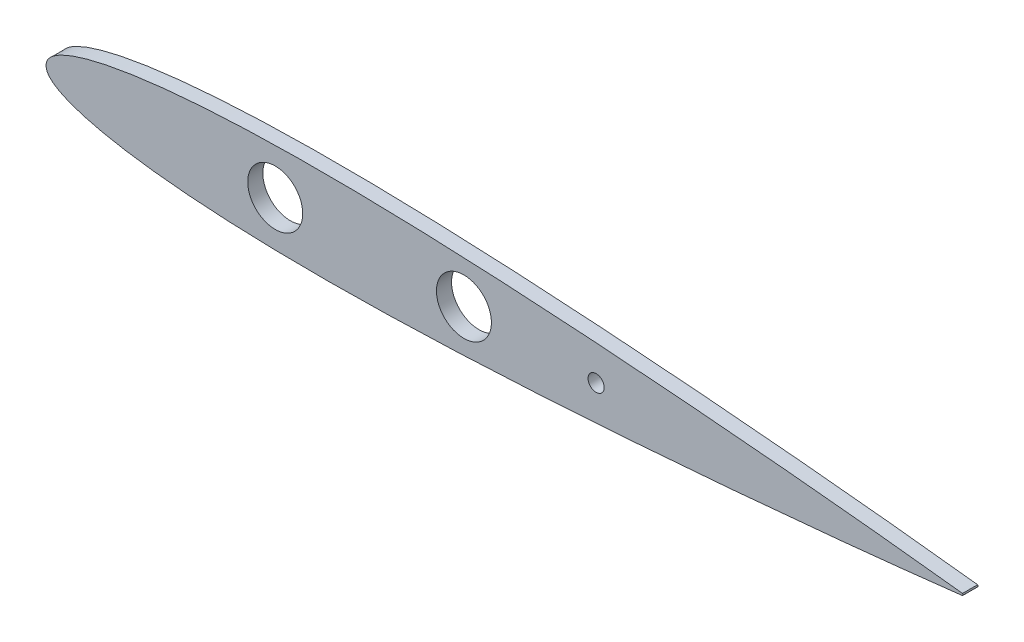
ISO-10303-21;
HEADER;
FILE_DESCRIPTION(('STEP AP214'),'2;1');
FILE_NAME('part.step','',(''),(''),'','','');
FILE_SCHEMA(('AUTOMOTIVE_DESIGN { 1 0 10303 214 1 1 1 1 }'));
ENDSEC;
DATA;
#1=APPLICATION_CONTEXT('core data for automotive mechanical design processes');
#2=APPLICATION_PROTOCOL_DEFINITION('international standard','automotive_design',2000,#1);
#3=PRODUCT_CONTEXT('',#1,'mechanical');
#4=PRODUCT('Part','Part','',(#3));
#5=PRODUCT_RELATED_PRODUCT_CATEGORY('part','',(#4));
#6=PRODUCT_DEFINITION_FORMATION('','',#4);
#7=PRODUCT_DEFINITION_CONTEXT('part definition',#1,'design');
#8=PRODUCT_DEFINITION('design','',#6,#7);
#9=PRODUCT_DEFINITION_SHAPE('','',#8);
#10=(LENGTH_UNIT() NAMED_UNIT(*) SI_UNIT(.MILLI.,.METRE.));
#11=(NAMED_UNIT(*) PLANE_ANGLE_UNIT() SI_UNIT($,.RADIAN.));
#12=(NAMED_UNIT(*) SI_UNIT($,.STERADIAN.) SOLID_ANGLE_UNIT());
#13=UNCERTAINTY_MEASURE_WITH_UNIT(LENGTH_MEASURE(1.E-05),#10,'distance_accuracy_value','');
#14=(GEOMETRIC_REPRESENTATION_CONTEXT(3) GLOBAL_UNCERTAINTY_ASSIGNED_CONTEXT((#13)) GLOBAL_UNIT_ASSIGNED_CONTEXT((#10,
#11,#12)) REPRESENTATION_CONTEXT('',''));
#15=CARTESIAN_POINT('',(0.,0.,0.));
#16=DIRECTION('',(0.,0.,1.));
#17=DIRECTION('',(1.,0.,0.));
#18=AXIS2_PLACEMENT_3D('',#15,#16,#17);
#19=CARTESIAN_POINT('',(110.,0.,1.4));
#20=CARTESIAN_POINT('',(110.027578175867,-0.236721440142772,1.4));
#21=CARTESIAN_POINT('',(110.085538217979,-0.734230220465975,1.4));
#22=CARTESIAN_POINT('',(110.530223641577,-1.42706975809109,1.4));
#23=CARTESIAN_POINT('',(111.196336340545,-2.07855523302878,1.4));
#24=CARTESIAN_POINT('',(112.109835923497,-2.70130638754161,1.4));
#25=CARTESIAN_POINT('',(113.256788366372,-3.29930923783809,1.4));
#26=CARTESIAN_POINT('',(114.637939719778,-3.87306046577258,1.4));
#27=CARTESIAN_POINT('',(116.24766579781,-4.42139238611828,1.4));
#28=CARTESIAN_POINT('',(118.081312132678,-4.94256764101073,1.4));
#29=CARTESIAN_POINT('',(120.133109351335,-5.43479747619412,1.4));
#30=CARTESIAN_POINT('',(122.397158973637,-5.89612056643677,1.4));
#31=CARTESIAN_POINT('',(124.867245825052,-6.32466607739586,1.4));
#32=CARTESIAN_POINT('',(127.536961088608,-6.71865034112428,1.4));
#33=CARTESIAN_POINT('',(130.399721685833,-7.07642431038863,1.4));
#34=CARTESIAN_POINT('',(133.44876289533,-7.39648056861162,1.4));
#35=CARTESIAN_POINT('',(136.677139412155,-7.67760454203032,1.4));
#36=CARTESIAN_POINT('',(140.077743555427,-7.91867894287145,1.4));
#37=CARTESIAN_POINT('',(143.643266298458,-8.11897556141504,1.4));
#38=CARTESIAN_POINT('',(147.366223919106,-8.27798597685019,1.4));
#39=CARTESIAN_POINT('',(151.238917925322,-8.39550607585732,1.4));
#40=CARTESIAN_POINT('',(155.253439755899,-8.47152880790102,1.4));
#41=CARTESIAN_POINT('',(159.401643403725,-8.50652296727325,1.4));
#42=CARTESIAN_POINT('',(163.675147454163,-8.5010026998616,1.4));
#43=CARTESIAN_POINT('',(168.065295924147,-8.45595366245417,1.4));
#44=CARTESIAN_POINT('',(172.563150271755,-8.37248656398386,1.4));
#45=CARTESIAN_POINT('',(177.159453511195,-8.25195768192942,1.4));
#46=CARTESIAN_POINT('',(181.844626933159,-8.09595849303594,1.4));
#47=CARTESIAN_POINT('',(186.60870012693,-7.90621829286941,1.4));
#48=CARTESIAN_POINT('',(191.441311474098,-7.68460443906704,1.4));
#49=CARTESIAN_POINT('',(196.331634567492,-7.43310533690328,1.4));
#50=CARTESIAN_POINT('',(201.268368916985,-7.15382688632495,1.4));
#51=CARTESIAN_POINT('',(206.239642946259,-6.84887299963153,1.4));
#52=CARTESIAN_POINT('',(211.232977593233,-6.52047434958792,1.4));
#53=CARTESIAN_POINT('',(216.235178286271,-6.17086457697306,1.4));
#54=CARTESIAN_POINT('',(221.232257466585,-5.802244474926,1.4));
#55=CARTESIAN_POINT('',(226.209311113548,-5.41695826474113,1.4));
#56=CARTESIAN_POINT('',(231.150377302515,-5.0173511026198,1.4));
#57=CARTESIAN_POINT('',(236.038226964104,-4.60581174883637,1.4));
#58=CARTESIAN_POINT('',(240.854179313273,-4.18491264898859,1.4));
#59=CARTESIAN_POINT('',(247.071089235748,-3.62220530992837,1.4));
#60=CARTESIAN_POINT('',(253.11611192075,-3.04786904369115,1.4));
#61=CARTESIAN_POINT('',(258.952644661846,-2.46718813772147,1.4));
#62=CARTESIAN_POINT('',(263.047743378214,-2.04785660385741,1.4));
#63=CARTESIAN_POINT('',(266.898988861825,-1.64260730411104,1.4));
#64=CARTESIAN_POINT('',(270.455833183168,-1.25859090467058,1.4));
#65=CARTESIAN_POINT('',(273.651166983567,-0.905304265461349,1.4));
#66=CARTESIAN_POINT('',(276.385426802208,-0.59643648193733,1.4));
#67=CARTESIAN_POINT('',(278.452596210234,-0.358958360844466,1.4));
#68=CARTESIAN_POINT('',(279.592043703671,-0.226075897783468,1.4));
#69=CARTESIAN_POINT('',(280.,-0.1785,1.4));
#70=B_SPLINE_CURVE_WITH_KNOTS('',3,(#19,#20,#21,#22,#23,#24,#25,#26,#27,#28,#29,#30,#31,#32,#33,
#34,#35,#36,#37,#38,#39,#40,#41,#42,#43,#44,#45,#46,#47,#48,#49,#50,#51,#52,#53,#54,#55,#56,#57,
#58,#59,#60,#61,#62,#63,#64,#65,#66,#67,#68,#69),.UNSPECIFIED.,.F.,.F.,(4,1,1,1,1,1,1,1,1,1,1,1,
1,1,1,1,1,1,1,1,1,1,1,1,1,1,1,1,1,1,1,1,1,1,1,1,1,1,1,1,1,1,1,1,1,1,1,1,4),(0.,
0.00409901119627066,0.00861474169622249,0.013934854724959,0.0202777746115639,0.0277529807018305,
0.0364102145151919,0.0462664329749759,0.057320237837208,0.0695589461393541,0.0829628608595683,
0.0975072182865541,0.113164081930894,0.129902689855954,0.147690303906216,0.166492184642367,
0.186271967143026,0.206991861424858,0.228612214931177,0.25109216492606,0.274388983443375,
0.298458209116087,0.323253842050884,0.348727970896163,0.374830386774719,0.401509190431855,
0.428710015672103,0.456376153594157,0.484448082863221,0.512863886613239,0.541558094079446,
0.570462312854758,0.599504247573885,0.628607348748546,0.657690446050344,0.68666723740018,
0.715444848929875,0.743923546361862,0.771994829811623,0.799540252867686,0.852512114582347,
0.877624445997917,0.901571133904992,0.924121062493777,0.944988816236938,0.963803938777258,
0.980044339265455,0.992855276358985,1.),.UNSPECIFIED.);
#71=DIRECTION('',(0.,0.,-1.));
#72=VECTOR('',#71,1.);
#73=SURFACE_OF_LINEAR_EXTRUSION('',#70,#72);
#74=CARTESIAN_POINT('',(110.,0.,-1.4));
#75=CARTESIAN_POINT('',(110.027578175867,-0.236721440142772,-1.4));
#76=CARTESIAN_POINT('',(110.085538217979,-0.734230220465975,-1.4));
#77=CARTESIAN_POINT('',(110.530223641577,-1.42706975809109,-1.4));
#78=CARTESIAN_POINT('',(111.196336340545,-2.07855523302878,-1.4));
#79=CARTESIAN_POINT('',(112.109835923497,-2.70130638754161,-1.4));
#80=CARTESIAN_POINT('',(113.256788366372,-3.29930923783809,-1.4));
#81=CARTESIAN_POINT('',(114.637939719778,-3.87306046577258,-1.4));
#82=CARTESIAN_POINT('',(116.24766579781,-4.42139238611828,-1.4));
#83=CARTESIAN_POINT('',(118.081312132678,-4.94256764101073,-1.4));
#84=CARTESIAN_POINT('',(120.133109351335,-5.43479747619412,-1.4));
#85=CARTESIAN_POINT('',(122.397158973637,-5.89612056643677,-1.4));
#86=CARTESIAN_POINT('',(124.867245825052,-6.32466607739586,-1.4));
#87=CARTESIAN_POINT('',(127.536961088608,-6.71865034112428,-1.4));
#88=CARTESIAN_POINT('',(130.399721685833,-7.07642431038863,-1.4));
#89=CARTESIAN_POINT('',(133.44876289533,-7.39648056861162,-1.4));
#90=CARTESIAN_POINT('',(136.677139412155,-7.67760454203032,-1.4));
#91=CARTESIAN_POINT('',(140.077743555427,-7.91867894287145,-1.4));
#92=CARTESIAN_POINT('',(143.643266298458,-8.11897556141504,-1.4));
#93=CARTESIAN_POINT('',(147.366223919106,-8.27798597685019,-1.4));
#94=CARTESIAN_POINT('',(151.238917925322,-8.39550607585732,-1.4));
#95=CARTESIAN_POINT('',(155.253439755899,-8.47152880790102,-1.4));
#96=CARTESIAN_POINT('',(159.401643403725,-8.50652296727325,-1.4));
#97=CARTESIAN_POINT('',(163.675147454163,-8.5010026998616,-1.4));
#98=CARTESIAN_POINT('',(168.065295924147,-8.45595366245417,-1.4));
#99=CARTESIAN_POINT('',(172.563150271755,-8.37248656398386,-1.4));
#100=CARTESIAN_POINT('',(177.159453511195,-8.25195768192942,-1.4));
#101=CARTESIAN_POINT('',(181.844626933159,-8.09595849303594,-1.4));
#102=CARTESIAN_POINT('',(186.60870012693,-7.90621829286941,-1.4));
#103=CARTESIAN_POINT('',(191.441311474098,-7.68460443906704,-1.4));
#104=CARTESIAN_POINT('',(196.331634567492,-7.43310533690328,-1.4));
#105=CARTESIAN_POINT('',(201.268368916985,-7.15382688632495,-1.4));
#106=CARTESIAN_POINT('',(206.239642946259,-6.84887299963153,-1.4));
#107=CARTESIAN_POINT('',(211.232977593233,-6.52047434958792,-1.4));
#108=CARTESIAN_POINT('',(216.235178286271,-6.17086457697306,-1.4));
#109=CARTESIAN_POINT('',(221.232257466585,-5.802244474926,-1.4));
#110=CARTESIAN_POINT('',(226.209311113548,-5.41695826474113,-1.4));
#111=CARTESIAN_POINT('',(231.150377302515,-5.0173511026198,-1.4));
#112=CARTESIAN_POINT('',(236.038226964104,-4.60581174883637,-1.4));
#113=CARTESIAN_POINT('',(240.854179313273,-4.18491264898859,-1.4));
#114=CARTESIAN_POINT('',(247.071089235748,-3.62220530992837,-1.4));
#115=CARTESIAN_POINT('',(253.11611192075,-3.04786904369115,-1.4));
#116=CARTESIAN_POINT('',(258.952644661846,-2.46718813772147,-1.4));
#117=CARTESIAN_POINT('',(263.047743378214,-2.04785660385741,-1.4));
#118=CARTESIAN_POINT('',(266.898988861825,-1.64260730411104,-1.4));
#119=CARTESIAN_POINT('',(270.455833183168,-1.25859090467058,-1.4));
#120=CARTESIAN_POINT('',(273.651166983567,-0.905304265461349,-1.4));
#121=CARTESIAN_POINT('',(276.385426802208,-0.59643648193733,-1.4));
#122=CARTESIAN_POINT('',(278.452596210234,-0.358958360844466,-1.4));
#123=CARTESIAN_POINT('',(279.592043703671,-0.226075897783468,-1.4));
#124=CARTESIAN_POINT('',(280.,-0.1785,-1.4));
#125=B_SPLINE_CURVE_WITH_KNOTS('',3,(#74,#75,#76,#77,#78,#79,#80,#81,#82,#83,#84,#85,#86,#87,
#88,#89,#90,#91,#92,#93,#94,#95,#96,#97,#98,#99,#100,#101,#102,#103,#104,#105,#106,#107,#108,
#109,#110,#111,#112,#113,#114,#115,#116,#117,#118,#119,#120,#121,#122,#123,#124),.UNSPECIFIED.,
.F.,.F.,(4,1,1,1,1,1,1,1,1,1,1,1,1,1,1,1,1,1,1,1,1,1,1,1,1,1,1,1,1,1,1,1,1,1,1,1,1,1,1,1,1,1,1,
1,1,1,1,1,4),(0.,0.00409901119627066,0.00861474169622249,0.013934854724959,0.0202777746115639,
0.0277529807018305,0.0364102145151919,0.0462664329749759,0.057320237837208,0.0695589461393541,
0.0829628608595683,0.0975072182865541,0.113164081930894,0.129902689855954,0.147690303906216,
0.166492184642367,0.186271967143026,0.206991861424858,0.228612214931177,0.25109216492606,
0.274388983443375,0.298458209116087,0.323253842050884,0.348727970896163,0.374830386774719,
0.401509190431855,0.428710015672103,0.456376153594157,0.484448082863221,0.512863886613239,
0.541558094079446,0.570462312854758,0.599504247573885,0.628607348748546,0.657690446050344,
0.68666723740018,0.715444848929875,0.743923546361862,0.771994829811623,0.799540252867686,
0.852512114582347,0.877624445997917,0.901571133904992,0.924121062493777,0.944988816236938,
0.963803938777258,0.980044339265455,0.992855276358985,1.),.UNSPECIFIED.);
#126=CARTESIAN_POINT('',(110.,0.,-1.4));
#127=VERTEX_POINT('',#126);
#128=CARTESIAN_POINT('',(280.,-0.1785,-1.4));
#129=VERTEX_POINT('',#128);
#130=EDGE_CURVE('E86',#127,#129,#125,.T.);
#131=ORIENTED_EDGE('',*,*,#130,.T.);
#132=DIRECTION('',(0.,0.,-1.));
#133=VECTOR('',#132,1.);
#134=CARTESIAN_POINT('',(280.,-0.1785,1.4));
#135=LINE('',#134,#133);
#136=CARTESIAN_POINT('',(280.,-0.1785,1.4));
#137=VERTEX_POINT('',#136);
#138=EDGE_CURVE('E11',#137,#129,#135,.T.);
#139=ORIENTED_EDGE('',*,*,#138,.F.);
#140=CARTESIAN_POINT('',(110.,0.,1.4));
#141=VERTEX_POINT('',#140);
#142=EDGE_CURVE('E75',#141,#137,#70,.T.);
#143=ORIENTED_EDGE('',*,*,#142,.F.);
#144=DIRECTION('',(0.,0.,-1.));
#145=VECTOR('',#144,1.);
#146=CARTESIAN_POINT('',(110.,0.,1.4));
#147=LINE('',#146,#145);
#148=EDGE_CURVE('E207',#141,#127,#147,.T.);
#149=ORIENTED_EDGE('',*,*,#148,.T.);
#150=EDGE_LOOP('',(#131,#139,#143,#149));
#151=FACE_BOUND('',#150,.T.);
#152=ADVANCED_FACE('F41',(#151),#73,.F.);
#153=CARTESIAN_POINT('',(279.8215,0.,1.4));
#154=DIRECTION('',(0.,0.,-1.));
#155=DIRECTION('',(-1.,0.,0.));
#156=AXIS2_PLACEMENT_3D('',#153,#154,#155);
#157=CYLINDRICAL_SURFACE('',#156,0.252437120883675);
#158=CARTESIAN_POINT('',(279.8215,0.,-1.4));
#159=DIRECTION('',(0.,0.,1.));
#160=DIRECTION('',(1.,0.,0.));
#161=AXIS2_PLACEMENT_3D('',#158,#159,#160);
#162=CIRCLE('',#161,0.252437120883675);
#163=CARTESIAN_POINT('',(280.,0.1785,-1.4));
#164=VERTEX_POINT('',#163);
#165=EDGE_CURVE('E228',#164,#129,#162,.F.);
#166=ORIENTED_EDGE('',*,*,#165,.F.);
#167=DIRECTION('',(0.,0.,-1.));
#168=VECTOR('',#167,1.);
#169=CARTESIAN_POINT('',(280.,0.1785,1.4));
#170=LINE('',#169,#168);
#171=CARTESIAN_POINT('',(280.,0.1785,1.4));
#172=VERTEX_POINT('',#171);
#173=EDGE_CURVE('E51',#172,#164,#170,.T.);
#174=ORIENTED_EDGE('',*,*,#173,.F.);
#175=CARTESIAN_POINT('',(279.8215,0.,1.4));
#176=DIRECTION('',(0.,0.,1.));
#177=DIRECTION('',(1.,0.,0.));
#178=AXIS2_PLACEMENT_3D('',#175,#176,#177);
#179=CIRCLE('',#178,0.252437120883675);
#180=EDGE_CURVE('E80',#172,#137,#179,.F.);
#181=ORIENTED_EDGE('',*,*,#180,.T.);
#182=ORIENTED_EDGE('',*,*,#138,.T.);
#183=EDGE_LOOP('',(#166,#174,#181,#182));
#184=FACE_BOUND('',#183,.T.);
#185=ADVANCED_FACE('F90',(#184),#157,.T.);
#186=CARTESIAN_POINT('',(187.518484280221,0.,1.4));
#187=DIRECTION('',(0.,0.,-1.));
#188=DIRECTION('',(-1.,0.,0.));
#189=AXIS2_PLACEMENT_3D('',#186,#187,#188);
#190=CYLINDRICAL_SURFACE('',#189,5.09999999999998);
#191=CARTESIAN_POINT('',(187.518484280221,0.,1.4));
#192=DIRECTION('',(0.,0.,1.));
#193=DIRECTION('',(1.,0.,0.));
#194=AXIS2_PLACEMENT_3D('',#191,#192,#193);
#195=CIRCLE('',#194,5.09999999999998);
#196=CARTESIAN_POINT('',(192.618484280221,0.,1.4));
#197=VERTEX_POINT('',#196);
#198=EDGE_CURVE('E214',#197,#197,#195,.T.);
#199=ORIENTED_EDGE('',*,*,#198,.T.);
#200=EDGE_LOOP('',(#199));
#201=FACE_BOUND('',#200,.T.);
#202=CARTESIAN_POINT('',(187.518484280221,0.,-1.4));
#203=DIRECTION('',(0.,0.,1.));
#204=DIRECTION('',(1.,0.,0.));
#205=AXIS2_PLACEMENT_3D('',#202,#203,#204);
#206=CIRCLE('',#205,5.09999999999998);
#207=CARTESIAN_POINT('',(192.618484280221,0.,-1.4));
#208=VERTEX_POINT('',#207);
#209=EDGE_CURVE('E197',#208,#208,#206,.T.);
#210=ORIENTED_EDGE('',*,*,#209,.F.);
#211=EDGE_LOOP('',(#210));
#212=FACE_BOUND('',#211,.T.);
#213=ADVANCED_FACE('F115',(#201,#212),#190,.F.);
#214=CARTESIAN_POINT('',(152.518484280221,0.,1.4));
#215=DIRECTION('',(0.,0.,-1.));
#216=DIRECTION('',(-1.,0.,0.));
#217=AXIS2_PLACEMENT_3D('',#214,#215,#216);
#218=CYLINDRICAL_SURFACE('',#217,5.09999999999998);
#219=CARTESIAN_POINT('',(152.518484280221,0.,1.4));
#220=DIRECTION('',(0.,0.,1.));
#221=DIRECTION('',(1.,0.,0.));
#222=AXIS2_PLACEMENT_3D('',#219,#220,#221);
#223=CIRCLE('',#222,5.09999999999998);
#224=CARTESIAN_POINT('',(157.618484280221,0.,1.4));
#225=VERTEX_POINT('',#224);
#226=EDGE_CURVE('E94',#225,#225,#223,.T.);
#227=ORIENTED_EDGE('',*,*,#226,.T.);
#228=EDGE_LOOP('',(#227));
#229=FACE_BOUND('',#228,.T.);
#230=CARTESIAN_POINT('',(152.518484280221,0.,-1.4));
#231=DIRECTION('',(0.,0.,1.));
#232=DIRECTION('',(1.,0.,0.));
#233=AXIS2_PLACEMENT_3D('',#230,#231,#232);
#234=CIRCLE('',#233,5.09999999999998);
#235=CARTESIAN_POINT('',(157.618484280221,0.,-1.4));
#236=VERTEX_POINT('',#235);
#237=EDGE_CURVE('E193',#236,#236,#234,.T.);
#238=ORIENTED_EDGE('',*,*,#237,.F.);
#239=EDGE_LOOP('',(#238));
#240=FACE_BOUND('',#239,.T.);
#241=ADVANCED_FACE('F112',(#229,#240),#218,.F.);
#242=CARTESIAN_POINT('',(280.,0.1785,1.4));
#243=CARTESIAN_POINT('',(279.592043703671,0.226075897783467,1.4));
#244=CARTESIAN_POINT('',(278.452596210234,0.358958360844463,1.4));
#245=CARTESIAN_POINT('',(276.385426802208,0.596436481937331,1.4));
#246=CARTESIAN_POINT('',(273.651166983567,0.905304265461348,1.4));
#247=CARTESIAN_POINT('',(270.455833183168,1.25859090467058,1.4));
#248=CARTESIAN_POINT('',(266.898988861825,1.64260730411104,1.4));
#249=CARTESIAN_POINT('',(263.047743378214,2.04785660385741,1.4));
#250=CARTESIAN_POINT('',(258.952644661846,2.46718813772148,1.4));
#251=CARTESIAN_POINT('',(253.11611192075,3.04786904369115,1.4));
#252=CARTESIAN_POINT('',(247.071089235748,3.62220530992837,1.4));
#253=CARTESIAN_POINT('',(240.854179313273,4.18491264898859,1.4));
#254=CARTESIAN_POINT('',(236.038226964104,4.60581174883637,1.4));
#255=CARTESIAN_POINT('',(231.150377302514,5.0173511026198,1.4));
#256=CARTESIAN_POINT('',(226.209311113549,5.41695826474113,1.4));
#257=CARTESIAN_POINT('',(221.232257466585,5.802244474926,1.4));
#258=CARTESIAN_POINT('',(216.235178286272,6.17086457697306,1.4));
#259=CARTESIAN_POINT('',(211.232977593233,6.52047434958791,1.4));
#260=CARTESIAN_POINT('',(206.239642946259,6.84887299963153,1.4));
#261=CARTESIAN_POINT('',(201.268368916985,7.15382688632495,1.4));
#262=CARTESIAN_POINT('',(196.331634567492,7.43310533690328,1.4));
#263=CARTESIAN_POINT('',(191.441311474098,7.68460443906704,1.4));
#264=CARTESIAN_POINT('',(186.608700126931,7.90621829286941,1.4));
#265=CARTESIAN_POINT('',(181.844626933159,8.09595849303594,1.4));
#266=CARTESIAN_POINT('',(177.159453511195,8.25195768192942,1.4));
#267=CARTESIAN_POINT('',(172.563150271755,8.37248656398387,1.4));
#268=CARTESIAN_POINT('',(168.065295924147,8.45595366245417,1.4));
#269=CARTESIAN_POINT('',(163.675147454163,8.5010026998616,1.4));
#270=CARTESIAN_POINT('',(159.401643403725,8.50652296727326,1.4));
#271=CARTESIAN_POINT('',(155.253439755899,8.47152880790102,1.4));
#272=CARTESIAN_POINT('',(151.238917925322,8.39550607585732,1.4));
#273=CARTESIAN_POINT('',(147.366223919106,8.27798597685019,1.4));
#274=CARTESIAN_POINT('',(143.643266298458,8.11897556141504,1.4));
#275=CARTESIAN_POINT('',(140.077743555427,7.91867894287145,1.4));
#276=CARTESIAN_POINT('',(136.677139412155,7.67760454203032,1.4));
#277=CARTESIAN_POINT('',(133.44876289533,7.39648056861162,1.4));
#278=CARTESIAN_POINT('',(130.399721685833,7.07642431038863,1.4));
#279=CARTESIAN_POINT('',(127.536961088608,6.71865034112428,1.4));
#280=CARTESIAN_POINT('',(124.867245825052,6.32466607739586,1.4));
#281=CARTESIAN_POINT('',(122.397158973637,5.89612056643678,1.4));
#282=CARTESIAN_POINT('',(120.133109351335,5.43479747619412,1.4));
#283=CARTESIAN_POINT('',(118.081312132678,4.94256764101073,1.4));
#284=CARTESIAN_POINT('',(116.247665797811,4.42139238611828,1.4));
#285=CARTESIAN_POINT('',(114.637939719778,3.87306046577258,1.4));
#286=CARTESIAN_POINT('',(113.256788366372,3.29930923783808,1.4));
#287=CARTESIAN_POINT('',(112.109835923497,2.70130638754162,1.4));
#288=CARTESIAN_POINT('',(111.196336340545,2.07855523302877,1.4));
#289=CARTESIAN_POINT('',(110.530223641577,1.42706975809109,1.4));
#290=CARTESIAN_POINT('',(110.085538217979,0.734230220465984,1.4));
#291=CARTESIAN_POINT('',(110.027578175867,0.236721440142773,1.4));
#292=CARTESIAN_POINT('',(110.,0.,1.4));
#293=B_SPLINE_CURVE_WITH_KNOTS('',3,(#242,#243,#244,#245,#246,#247,#248,#249,#250,#251,#252,
#253,#254,#255,#256,#257,#258,#259,#260,#261,#262,#263,#264,#265,#266,#267,#268,#269,#270,#271,
#272,#273,#274,#275,#276,#277,#278,#279,#280,#281,#282,#283,#284,#285,#286,#287,#288,#289,#290,
#291,#292),.UNSPECIFIED.,.F.,.F.,(4,1,1,1,1,1,1,1,1,1,1,1,1,1,1,1,1,1,1,1,1,1,1,1,1,1,1,1,1,1,1,
1,1,1,1,1,1,1,1,1,1,1,1,1,1,1,1,1,4),(0.,0.00714472364101537,0.0199556607345446,
0.0361960612227423,0.0550111837630616,0.0758789375062231,0.0984288660950085,0.122375554002083,
0.147487885417653,0.200459747132314,0.228005170188377,0.256076453638138,0.284555151070125,
0.31333276259982,0.342309553949656,0.371392651251454,0.400495752426115,0.429537687145242,
0.458441905920554,0.487136113386761,0.515551917136779,0.543623846405843,0.571289984327897,
0.598490809568145,0.625169613225281,0.651272029103837,0.676746157949116,0.701541790883913,
0.725611016556625,0.74890783507394,0.771387785068823,0.793008138575143,0.813728032856974,
0.833507815357633,0.852309696093785,0.870097310144046,0.886835918069106,0.902492781713446,
0.917037139140432,0.930441053860646,0.942679762162792,0.953733567025024,0.963589785484808,
0.97224701929817,0.979722225388436,0.986065145275041,0.991385258303778,0.995900988803729,1.),.UNSPECIFIED.);
#294=DIRECTION('',(0.,0.,-1.));
#295=VECTOR('',#294,1.);
#296=SURFACE_OF_LINEAR_EXTRUSION('',#293,#295);
#297=CARTESIAN_POINT('',(280.,0.1785,-1.4));
#298=CARTESIAN_POINT('',(279.592043703671,0.226075897783467,-1.4));
#299=CARTESIAN_POINT('',(278.452596210234,0.358958360844463,-1.4));
#300=CARTESIAN_POINT('',(276.385426802208,0.596436481937331,-1.4));
#301=CARTESIAN_POINT('',(273.651166983567,0.905304265461348,-1.4));
#302=CARTESIAN_POINT('',(270.455833183168,1.25859090467058,-1.4));
#303=CARTESIAN_POINT('',(266.898988861825,1.64260730411104,-1.4));
#304=CARTESIAN_POINT('',(263.047743378214,2.04785660385741,-1.4));
#305=CARTESIAN_POINT('',(258.952644661846,2.46718813772148,-1.4));
#306=CARTESIAN_POINT('',(253.11611192075,3.04786904369115,-1.4));
#307=CARTESIAN_POINT('',(247.071089235748,3.62220530992837,-1.4));
#308=CARTESIAN_POINT('',(240.854179313273,4.18491264898859,-1.4));
#309=CARTESIAN_POINT('',(236.038226964104,4.60581174883637,-1.4));
#310=CARTESIAN_POINT('',(231.150377302514,5.0173511026198,-1.4));
#311=CARTESIAN_POINT('',(226.209311113549,5.41695826474113,-1.4));
#312=CARTESIAN_POINT('',(221.232257466585,5.802244474926,-1.4));
#313=CARTESIAN_POINT('',(216.235178286272,6.17086457697306,-1.4));
#314=CARTESIAN_POINT('',(211.232977593233,6.52047434958791,-1.4));
#315=CARTESIAN_POINT('',(206.239642946259,6.84887299963153,-1.4));
#316=CARTESIAN_POINT('',(201.268368916985,7.15382688632495,-1.4));
#317=CARTESIAN_POINT('',(196.331634567492,7.43310533690328,-1.4));
#318=CARTESIAN_POINT('',(191.441311474098,7.68460443906704,-1.4));
#319=CARTESIAN_POINT('',(186.608700126931,7.90621829286941,-1.4));
#320=CARTESIAN_POINT('',(181.844626933159,8.09595849303594,-1.4));
#321=CARTESIAN_POINT('',(177.159453511195,8.25195768192942,-1.4));
#322=CARTESIAN_POINT('',(172.563150271755,8.37248656398387,-1.4));
#323=CARTESIAN_POINT('',(168.065295924147,8.45595366245417,-1.4));
#324=CARTESIAN_POINT('',(163.675147454163,8.5010026998616,-1.4));
#325=CARTESIAN_POINT('',(159.401643403725,8.50652296727326,-1.4));
#326=CARTESIAN_POINT('',(155.253439755899,8.47152880790102,-1.4));
#327=CARTESIAN_POINT('',(151.238917925322,8.39550607585732,-1.4));
#328=CARTESIAN_POINT('',(147.366223919106,8.27798597685019,-1.4));
#329=CARTESIAN_POINT('',(143.643266298458,8.11897556141504,-1.4));
#330=CARTESIAN_POINT('',(140.077743555427,7.91867894287145,-1.4));
#331=CARTESIAN_POINT('',(136.677139412155,7.67760454203032,-1.4));
#332=CARTESIAN_POINT('',(133.44876289533,7.39648056861162,-1.4));
#333=CARTESIAN_POINT('',(130.399721685833,7.07642431038863,-1.4));
#334=CARTESIAN_POINT('',(127.536961088608,6.71865034112428,-1.4));
#335=CARTESIAN_POINT('',(124.867245825052,6.32466607739586,-1.4));
#336=CARTESIAN_POINT('',(122.397158973637,5.89612056643678,-1.4));
#337=CARTESIAN_POINT('',(120.133109351335,5.43479747619412,-1.4));
#338=CARTESIAN_POINT('',(118.081312132678,4.94256764101073,-1.4));
#339=CARTESIAN_POINT('',(116.247665797811,4.42139238611828,-1.4));
#340=CARTESIAN_POINT('',(114.637939719778,3.87306046577258,-1.4));
#341=CARTESIAN_POINT('',(113.256788366372,3.29930923783808,-1.4));
#342=CARTESIAN_POINT('',(112.109835923497,2.70130638754162,-1.4));
#343=CARTESIAN_POINT('',(111.196336340545,2.07855523302877,-1.4));
#344=CARTESIAN_POINT('',(110.530223641577,1.42706975809109,-1.4));
#345=CARTESIAN_POINT('',(110.085538217979,0.734230220465984,-1.4));
#346=CARTESIAN_POINT('',(110.027578175867,0.236721440142773,-1.4));
#347=CARTESIAN_POINT('',(110.,0.,-1.4));
#348=B_SPLINE_CURVE_WITH_KNOTS('',3,(#297,#298,#299,#300,#301,#302,#303,#304,#305,#306,#307,
#308,#309,#310,#311,#312,#313,#314,#315,#316,#317,#318,#319,#320,#321,#322,#323,#324,#325,#326,
#327,#328,#329,#330,#331,#332,#333,#334,#335,#336,#337,#338,#339,#340,#341,#342,#343,#344,#345,
#346,#347),.UNSPECIFIED.,.F.,.F.,(4,1,1,1,1,1,1,1,1,1,1,1,1,1,1,1,1,1,1,1,1,1,1,1,1,1,1,1,1,1,1,
1,1,1,1,1,1,1,1,1,1,1,1,1,1,1,1,1,4),(0.,0.00714472364101537,0.0199556607345446,
0.0361960612227423,0.0550111837630616,0.0758789375062231,0.0984288660950085,0.122375554002083,
0.147487885417653,0.200459747132314,0.228005170188377,0.256076453638138,0.284555151070125,
0.31333276259982,0.342309553949656,0.371392651251454,0.400495752426115,0.429537687145242,
0.458441905920554,0.487136113386761,0.515551917136779,0.543623846405843,0.571289984327897,
0.598490809568145,0.625169613225281,0.651272029103837,0.676746157949116,0.701541790883913,
0.725611016556625,0.74890783507394,0.771387785068823,0.793008138575143,0.813728032856974,
0.833507815357633,0.852309696093785,0.870097310144046,0.886835918069106,0.902492781713446,
0.917037139140432,0.930441053860646,0.942679762162792,0.953733567025024,0.963589785484808,
0.97224701929817,0.979722225388436,0.986065145275041,0.991385258303778,0.995900988803729,1.),.UNSPECIFIED.);
#349=EDGE_CURVE('E72',#164,#127,#348,.T.);
#350=ORIENTED_EDGE('',*,*,#349,.T.);
#351=ORIENTED_EDGE('',*,*,#148,.F.);
#352=EDGE_CURVE('E59',#172,#141,#293,.T.);
#353=ORIENTED_EDGE('',*,*,#352,.F.);
#354=ORIENTED_EDGE('',*,*,#173,.T.);
#355=EDGE_LOOP('',(#350,#351,#353,#354));
#356=FACE_BOUND('',#355,.T.);
#357=ADVANCED_FACE('F108',(#356),#296,.F.);
#358=CARTESIAN_POINT('',(212.04436227253,0.,1.4));
#359=DIRECTION('',(0.,0.,-1.));
#360=DIRECTION('',(-1.,0.,0.));
#361=AXIS2_PLACEMENT_3D('',#358,#359,#360);
#362=CYLINDRICAL_SURFACE('',#361,1.5);
#363=CARTESIAN_POINT('',(212.04436227253,0.,1.4));
#364=DIRECTION('',(0.,0.,1.));
#365=DIRECTION('',(1.,0.,0.));
#366=AXIS2_PLACEMENT_3D('',#363,#364,#365);
#367=CIRCLE('',#366,1.5);
#368=CARTESIAN_POINT('',(213.54436227253,0.,1.4));
#369=VERTEX_POINT('',#368);
#370=EDGE_CURVE('E209',#369,#369,#367,.T.);
#371=ORIENTED_EDGE('',*,*,#370,.T.);
#372=EDGE_LOOP('',(#371));
#373=FACE_BOUND('',#372,.T.);
#374=CARTESIAN_POINT('',(212.04436227253,0.,-1.4));
#375=DIRECTION('',(0.,0.,1.));
#376=DIRECTION('',(1.,0.,0.));
#377=AXIS2_PLACEMENT_3D('',#374,#375,#376);
#378=CIRCLE('',#377,1.5);
#379=CARTESIAN_POINT('',(213.54436227253,0.,-1.4));
#380=VERTEX_POINT('',#379);
#381=EDGE_CURVE('E83',#380,#380,#378,.T.);
#382=ORIENTED_EDGE('',*,*,#381,.F.);
#383=EDGE_LOOP('',(#382));
#384=FACE_BOUND('',#383,.T.);
#385=ADVANCED_FACE('F111',(#373,#384),#362,.F.);
#386=CARTESIAN_POINT('',(0.,0.,1.4));
#387=DIRECTION('',(0.,0.,1.));
#388=DIRECTION('',(1.,0.,0.));
#389=AXIS2_PLACEMENT_3D('',#386,#387,#388);
#390=PLANE('',#389);
#391=ORIENTED_EDGE('',*,*,#142,.T.);
#392=ORIENTED_EDGE('',*,*,#180,.F.);
#393=ORIENTED_EDGE('',*,*,#352,.T.);
#394=EDGE_LOOP('',(#391,#392,#393));
#395=FACE_BOUND('',#394,.T.);
#396=ORIENTED_EDGE('',*,*,#226,.F.);
#397=EDGE_LOOP('',(#396));
#398=FACE_BOUND('',#397,.T.);
#399=ORIENTED_EDGE('',*,*,#198,.F.);
#400=EDGE_LOOP('',(#399));
#401=FACE_BOUND('',#400,.T.);
#402=ORIENTED_EDGE('',*,*,#370,.F.);
#403=EDGE_LOOP('',(#402));
#404=FACE_BOUND('',#403,.T.);
#405=ADVANCED_FACE('F77',(#395,#398,#401,#404),#390,.T.);
#406=CARTESIAN_POINT('',(0.,0.,-1.4));
#407=DIRECTION('',(0.,0.,1.));
#408=DIRECTION('',(1.,0.,0.));
#409=AXIS2_PLACEMENT_3D('',#406,#407,#408);
#410=PLANE('',#409);
#411=ORIENTED_EDGE('',*,*,#130,.F.);
#412=ORIENTED_EDGE('',*,*,#349,.F.);
#413=ORIENTED_EDGE('',*,*,#165,.T.);
#414=EDGE_LOOP('',(#411,#412,#413));
#415=FACE_BOUND('',#414,.T.);
#416=ORIENTED_EDGE('',*,*,#237,.T.);
#417=EDGE_LOOP('',(#416));
#418=FACE_BOUND('',#417,.T.);
#419=ORIENTED_EDGE('',*,*,#209,.T.);
#420=EDGE_LOOP('',(#419));
#421=FACE_BOUND('',#420,.T.);
#422=ORIENTED_EDGE('',*,*,#381,.T.);
#423=EDGE_LOOP('',(#422));
#424=FACE_BOUND('',#423,.T.);
#425=ADVANCED_FACE('F166',(#415,#418,#421,#424),#410,.F.);
#426=CLOSED_SHELL('',(#152,#185,#213,#241,#357,#385,#405,#425));
#427=MANIFOLD_SOLID_BREP('B2',#426);
#428=ADVANCED_BREP_SHAPE_REPRESENTATION('',(#18,#427),#14);
#429=SHAPE_DEFINITION_REPRESENTATION(#9,#428);
ENDSEC;
END-ISO-10303-21;
